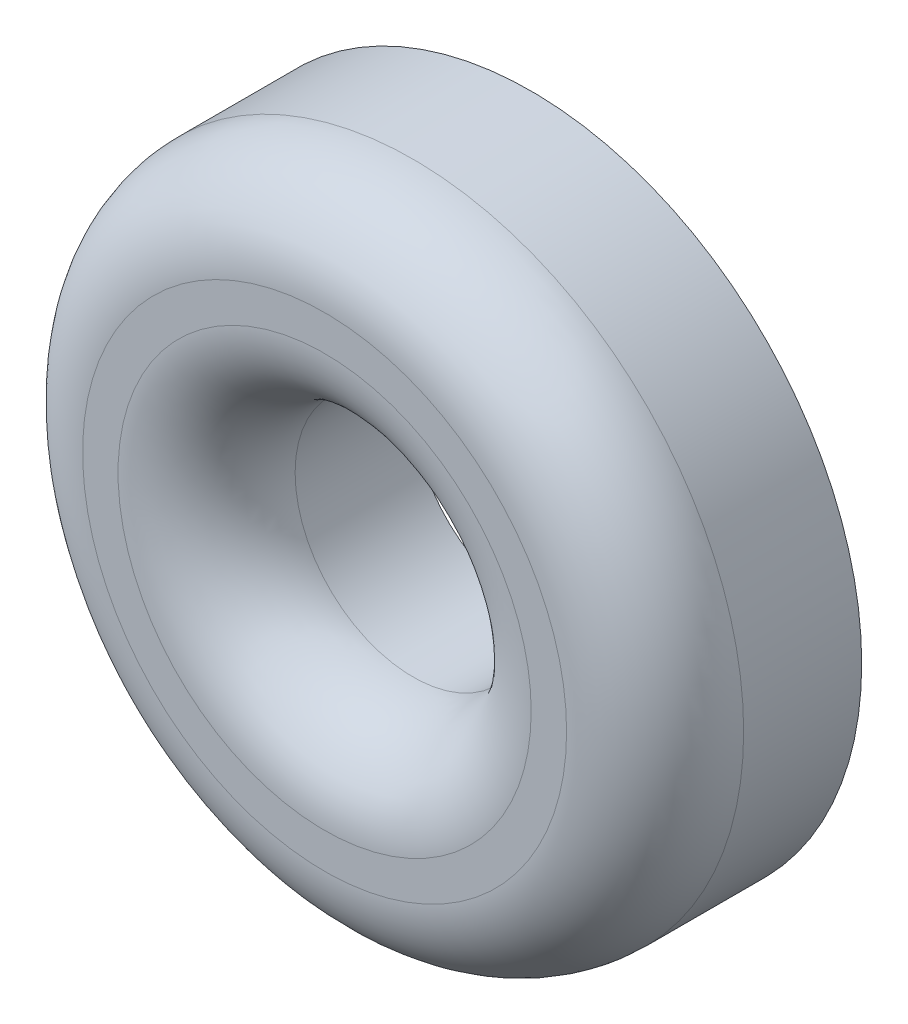
ISO-10303-21;
HEADER;
FILE_DESCRIPTION(('STEP AP214'),'2;1');
FILE_NAME('part.step','',(''),(''),'','','');
FILE_SCHEMA(('AUTOMOTIVE_DESIGN { 1 0 10303 214 1 1 1 1 }'));
ENDSEC;
DATA;
#1=APPLICATION_CONTEXT('core data for automotive mechanical design processes');
#2=APPLICATION_PROTOCOL_DEFINITION('international standard','automotive_design',2000,#1);
#3=PRODUCT_CONTEXT('',#1,'mechanical');
#4=PRODUCT('Part','Part','',(#3));
#5=PRODUCT_RELATED_PRODUCT_CATEGORY('part','',(#4));
#6=PRODUCT_DEFINITION_FORMATION('','',#4);
#7=PRODUCT_DEFINITION_CONTEXT('part definition',#1,'design');
#8=PRODUCT_DEFINITION('design','',#6,#7);
#9=PRODUCT_DEFINITION_SHAPE('','',#8);
#10=(LENGTH_UNIT() NAMED_UNIT(*) SI_UNIT(.MILLI.,.METRE.));
#11=(NAMED_UNIT(*) PLANE_ANGLE_UNIT() SI_UNIT($,.RADIAN.));
#12=(NAMED_UNIT(*) SI_UNIT($,.STERADIAN.) SOLID_ANGLE_UNIT());
#13=UNCERTAINTY_MEASURE_WITH_UNIT(LENGTH_MEASURE(1.E-05),#10,'distance_accuracy_value','');
#14=(GEOMETRIC_REPRESENTATION_CONTEXT(3) GLOBAL_UNCERTAINTY_ASSIGNED_CONTEXT((#13)) GLOBAL_UNIT_ASSIGNED_CONTEXT((#10,
#11,#12)) REPRESENTATION_CONTEXT('',''));
#15=CARTESIAN_POINT('',(0.,0.,0.));
#16=DIRECTION('',(0.,0.,1.));
#17=DIRECTION('',(1.,0.,0.));
#18=AXIS2_PLACEMENT_3D('',#15,#16,#17);
#19=CARTESIAN_POINT('',(0.,0.,1.75));
#20=DIRECTION('',(0.,0.,1.));
#21=DIRECTION('',(1.,0.,0.));
#22=AXIS2_PLACEMENT_3D('',#19,#20,#21);
#23=PLANE('',#22);
#24=CARTESIAN_POINT('',(0.,0.,1.75));
#25=DIRECTION('',(0.,0.,1.));
#26=DIRECTION('',(1.,0.,0.));
#27=AXIS2_PLACEMENT_3D('',#24,#25,#26);
#28=CIRCLE('',#27,1.75);
#29=CARTESIAN_POINT('',(1.75,0.,1.75));
#30=VERTEX_POINT('',#29);
#31=EDGE_CURVE('E38',#30,#30,#28,.F.);
#32=ORIENTED_EDGE('',*,*,#31,.T.);
#33=EDGE_LOOP('',(#32));
#34=FACE_BOUND('',#33,.T.);
#35=CARTESIAN_POINT('',(0.,0.,1.75));
#36=DIRECTION('',(0.,0.,1.));
#37=DIRECTION('',(1.,0.,0.));
#38=AXIS2_PLACEMENT_3D('',#35,#36,#37);
#39=CIRCLE('',#38,2.05);
#40=CARTESIAN_POINT('',(2.05,0.,1.75));
#41=VERTEX_POINT('',#40);
#42=EDGE_CURVE('E42',#41,#41,#39,.T.);
#43=ORIENTED_EDGE('',*,*,#42,.T.);
#44=EDGE_LOOP('',(#43));
#45=FACE_BOUND('',#44,.T.);
#46=ADVANCED_FACE('F31',(#34,#45),#23,.T.);
#47=CARTESIAN_POINT('',(0.,0.,0.));
#48=DIRECTION('',(0.,0.,1.));
#49=DIRECTION('',(1.,0.,0.));
#50=AXIS2_PLACEMENT_3D('',#47,#48,#49);
#51=PLANE('',#50);
#52=CARTESIAN_POINT('',(0.,0.,0.));
#53=DIRECTION('',(0.,0.,1.));
#54=DIRECTION('',(1.,0.,0.));
#55=AXIS2_PLACEMENT_3D('',#52,#53,#54);
#56=CIRCLE('',#55,2.8);
#57=CARTESIAN_POINT('',(2.8,0.,0.));
#58=VERTEX_POINT('',#57);
#59=EDGE_CURVE('E51',#58,#58,#56,.T.);
#60=ORIENTED_EDGE('',*,*,#59,.F.);
#61=EDGE_LOOP('',(#60));
#62=FACE_BOUND('',#61,.T.);
#63=CARTESIAN_POINT('',(0.,0.,0.));
#64=DIRECTION('',(0.,0.,1.));
#65=DIRECTION('',(1.,0.,0.));
#66=AXIS2_PLACEMENT_3D('',#63,#64,#65);
#67=CIRCLE('',#66,1.);
#68=CARTESIAN_POINT('',(1.,0.,0.));
#69=VERTEX_POINT('',#68);
#70=EDGE_CURVE('E54',#69,#69,#67,.T.);
#71=ORIENTED_EDGE('',*,*,#70,.T.);
#72=EDGE_LOOP('',(#71));
#73=FACE_BOUND('',#72,.T.);
#74=ADVANCED_FACE('F58',(#62,#73),#51,.F.);
#75=CARTESIAN_POINT('',(0.,0.,1.75));
#76=DIRECTION('',(0.,0.,-1.));
#77=DIRECTION('',(-1.,0.,0.));
#78=AXIS2_PLACEMENT_3D('',#75,#76,#77);
#79=CYLINDRICAL_SURFACE('',#78,2.8);
#80=CARTESIAN_POINT('',(0.,0.,1.));
#81=DIRECTION('',(0.,0.,1.));
#82=DIRECTION('',(1.,0.,0.));
#83=AXIS2_PLACEMENT_3D('',#80,#81,#82);
#84=CIRCLE('',#83,2.8);
#85=CARTESIAN_POINT('',(2.8,0.,1.));
#86=VERTEX_POINT('',#85);
#87=EDGE_CURVE('E10',#86,#86,#84,.F.);
#88=ORIENTED_EDGE('',*,*,#87,.T.);
#89=EDGE_LOOP('',(#88));
#90=FACE_BOUND('',#89,.T.);
#91=ORIENTED_EDGE('',*,*,#59,.T.);
#92=EDGE_LOOP('',(#91));
#93=FACE_BOUND('',#92,.T.);
#94=ADVANCED_FACE('F63',(#90,#93),#79,.T.);
#95=CARTESIAN_POINT('',(0.,0.,1.75));
#96=DIRECTION('',(0.,0.,-1.));
#97=DIRECTION('',(-1.,0.,0.));
#98=AXIS2_PLACEMENT_3D('',#95,#96,#97);
#99=CYLINDRICAL_SURFACE('',#98,1.);
#100=CARTESIAN_POINT('',(0.,0.,1.));
#101=DIRECTION('',(0.,0.,1.));
#102=DIRECTION('',(1.,0.,0.));
#103=AXIS2_PLACEMENT_3D('',#100,#101,#102);
#104=CIRCLE('',#103,1.);
#105=CARTESIAN_POINT('',(1.,0.,1.));
#106=VERTEX_POINT('',#105);
#107=EDGE_CURVE('E46',#106,#106,#104,.T.);
#108=ORIENTED_EDGE('',*,*,#107,.T.);
#109=EDGE_LOOP('',(#108));
#110=FACE_BOUND('',#109,.T.);
#111=ORIENTED_EDGE('',*,*,#70,.F.);
#112=EDGE_LOOP('',(#111));
#113=FACE_BOUND('',#112,.T.);
#114=ADVANCED_FACE('F60',(#110,#113),#99,.F.);
#115=CARTESIAN_POINT('',(0.,0.,1.));
#116=DIRECTION('',(0.,0.,1.));
#117=DIRECTION('',(1.,0.,0.));
#118=AXIS2_PLACEMENT_3D('',#115,#116,#117);
#119=TOROIDAL_SURFACE('',#118,1.75,0.75);
#120=ORIENTED_EDGE('',*,*,#31,.F.);
#121=EDGE_LOOP('',(#120));
#122=FACE_BOUND('',#121,.T.);
#123=ORIENTED_EDGE('',*,*,#107,.F.);
#124=EDGE_LOOP('',(#123));
#125=FACE_BOUND('',#124,.T.);
#126=ADVANCED_FACE('F62',(#122,#125),#119,.T.);
#127=CARTESIAN_POINT('',(0.,0.,1.));
#128=DIRECTION('',(0.,0.,1.));
#129=DIRECTION('',(1.,0.,0.));
#130=AXIS2_PLACEMENT_3D('',#127,#128,#129);
#131=TOROIDAL_SURFACE('',#130,2.05,0.75);
#132=ORIENTED_EDGE('',*,*,#87,.F.);
#133=EDGE_LOOP('',(#132));
#134=FACE_BOUND('',#133,.T.);
#135=ORIENTED_EDGE('',*,*,#42,.F.);
#136=EDGE_LOOP('',(#135));
#137=FACE_BOUND('',#136,.T.);
#138=ADVANCED_FACE('F33',(#134,#137),#131,.T.);
#139=CLOSED_SHELL('',(#46,#74,#94,#114,#126,#138));
#140=MANIFOLD_SOLID_BREP('B2',#139);
#141=ADVANCED_BREP_SHAPE_REPRESENTATION('',(#18,#140),#14);
#142=SHAPE_DEFINITION_REPRESENTATION(#9,#141);
ENDSEC;
END-ISO-10303-21;
